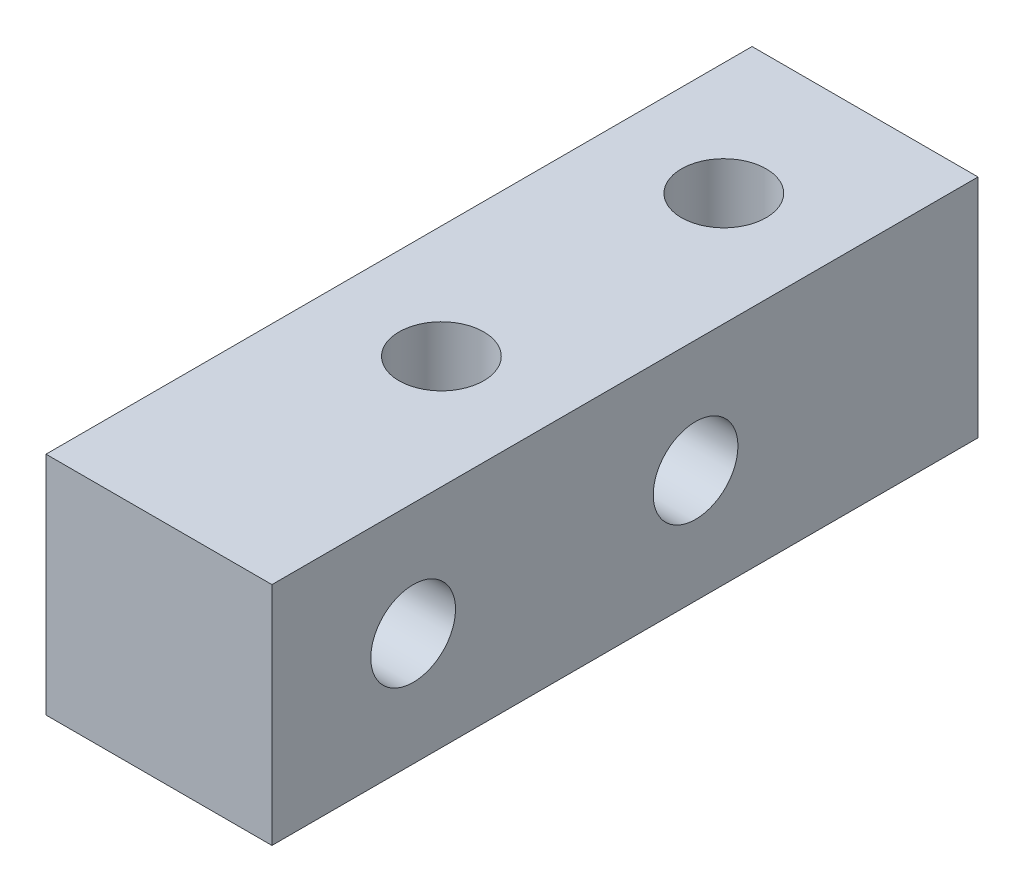
ISO-10303-21;
HEADER;
FILE_DESCRIPTION(('STEP AP214'),'2;1');
FILE_NAME('part.step','',(''),(''),'','','');
FILE_SCHEMA(('AUTOMOTIVE_DESIGN { 1 0 10303 214 1 1 1 1 }'));
ENDSEC;
DATA;
#1=APPLICATION_CONTEXT('core data for automotive mechanical design processes');
#2=APPLICATION_PROTOCOL_DEFINITION('international standard','automotive_design',2000,#1);
#3=PRODUCT_CONTEXT('',#1,'mechanical');
#4=PRODUCT('Part','Part','',(#3));
#5=PRODUCT_RELATED_PRODUCT_CATEGORY('part','',(#4));
#6=PRODUCT_DEFINITION_FORMATION('','',#4);
#7=PRODUCT_DEFINITION_CONTEXT('part definition',#1,'design');
#8=PRODUCT_DEFINITION('design','',#6,#7);
#9=PRODUCT_DEFINITION_SHAPE('','',#8);
#10=(LENGTH_UNIT() NAMED_UNIT(*) SI_UNIT(.MILLI.,.METRE.));
#11=(NAMED_UNIT(*) PLANE_ANGLE_UNIT() SI_UNIT($,.RADIAN.));
#12=(NAMED_UNIT(*) SI_UNIT($,.STERADIAN.) SOLID_ANGLE_UNIT());
#13=UNCERTAINTY_MEASURE_WITH_UNIT(LENGTH_MEASURE(1.E-05),#10,'distance_accuracy_value','');
#14=(GEOMETRIC_REPRESENTATION_CONTEXT(3) GLOBAL_UNCERTAINTY_ASSIGNED_CONTEXT((#13)) GLOBAL_UNIT_ASSIGNED_CONTEXT((#10,
#11,#12)) REPRESENTATION_CONTEXT('',''));
#15=CARTESIAN_POINT('',(0.,0.,0.));
#16=DIRECTION('',(0.,0.,1.));
#17=DIRECTION('',(1.,0.,0.));
#18=AXIS2_PLACEMENT_3D('',#15,#16,#17);
#19=CARTESIAN_POINT('',(0.,0.,25.));
#20=DIRECTION('',(1.,0.,0.));
#21=DIRECTION('',(0.,1.,0.));
#22=AXIS2_PLACEMENT_3D('',#19,#20,#21);
#23=PLANE('',#22);
#24=CARTESIAN_POINT('',(0.,4.,20.));
#25=DIRECTION('',(1.,0.,0.));
#26=DIRECTION('',(0.,1.,0.));
#27=AXIS2_PLACEMENT_3D('',#24,#25,#26);
#28=CIRCLE('',#27,1.5);
#29=CARTESIAN_POINT('',(0.,4.,18.5));
#30=VERTEX_POINT('',#29);
#31=EDGE_CURVE('E127',#30,#30,#28,.T.);
#32=ORIENTED_EDGE('',*,*,#31,.T.);
#33=EDGE_LOOP('',(#32));
#34=FACE_BOUND('',#33,.T.);
#35=CARTESIAN_POINT('',(0.,4.,10.));
#36=DIRECTION('',(1.,0.,0.));
#37=DIRECTION('',(0.,1.,0.));
#38=AXIS2_PLACEMENT_3D('',#35,#36,#37);
#39=CIRCLE('',#38,1.5);
#40=CARTESIAN_POINT('',(0.,4.,8.5));
#41=VERTEX_POINT('',#40);
#42=EDGE_CURVE('E132',#41,#41,#39,.T.);
#43=ORIENTED_EDGE('',*,*,#42,.T.);
#44=EDGE_LOOP('',(#43));
#45=FACE_BOUND('',#44,.T.);
#46=DIRECTION('',(0.,-1.,0.));
#47=VECTOR('',#46,1.);
#48=CARTESIAN_POINT('',(0.,0.,0.));
#49=LINE('',#48,#47);
#50=CARTESIAN_POINT('',(0.,8.,0.));
#51=VERTEX_POINT('',#50);
#52=CARTESIAN_POINT('',(0.,0.,0.));
#53=VERTEX_POINT('',#52);
#54=EDGE_CURVE('E104',#51,#53,#49,.T.);
#55=ORIENTED_EDGE('',*,*,#54,.T.);
#56=DIRECTION('',(0.,0.,-1.));
#57=VECTOR('',#56,1.);
#58=CARTESIAN_POINT('',(0.,0.,25.));
#59=LINE('',#58,#57);
#60=CARTESIAN_POINT('',(0.,0.,25.));
#61=VERTEX_POINT('',#60);
#62=EDGE_CURVE('E11',#61,#53,#59,.T.);
#63=ORIENTED_EDGE('',*,*,#62,.F.);
#64=DIRECTION('',(0.,-1.,0.));
#65=VECTOR('',#64,1.);
#66=CARTESIAN_POINT('',(0.,0.,25.));
#67=LINE('',#66,#65);
#68=CARTESIAN_POINT('',(0.,8.,25.));
#69=VERTEX_POINT('',#68);
#70=EDGE_CURVE('E92',#69,#61,#67,.T.);
#71=ORIENTED_EDGE('',*,*,#70,.F.);
#72=DIRECTION('',(0.,0.,-1.));
#73=VECTOR('',#72,1.);
#74=CARTESIAN_POINT('',(0.,8.,25.));
#75=LINE('',#74,#73);
#76=EDGE_CURVE('E100',#69,#51,#75,.T.);
#77=ORIENTED_EDGE('',*,*,#76,.T.);
#78=EDGE_LOOP('',(#55,#63,#71,#77));
#79=FACE_BOUND('',#78,.T.);
#80=ADVANCED_FACE('F41',(#34,#45,#79),#23,.F.);
#81=CARTESIAN_POINT('',(0.,0.,25.));
#82=DIRECTION('',(0.,1.,0.));
#83=DIRECTION('',(0.,0.,1.));
#84=AXIS2_PLACEMENT_3D('',#81,#82,#83);
#85=PLANE('',#84);
#86=CARTESIAN_POINT('',(4.,0.,5.));
#87=DIRECTION('',(0.,1.,0.));
#88=DIRECTION('',(0.,0.,1.));
#89=AXIS2_PLACEMENT_3D('',#86,#87,#88);
#90=CIRCLE('',#89,1.5);
#91=CARTESIAN_POINT('',(4.,0.,6.5));
#92=VERTEX_POINT('',#91);
#93=EDGE_CURVE('E107',#92,#92,#90,.T.);
#94=ORIENTED_EDGE('',*,*,#93,.T.);
#95=EDGE_LOOP('',(#94));
#96=FACE_BOUND('',#95,.T.);
#97=CARTESIAN_POINT('',(4.,0.,15.));
#98=DIRECTION('',(0.,1.,0.));
#99=DIRECTION('',(0.,0.,1.));
#100=AXIS2_PLACEMENT_3D('',#97,#98,#99);
#101=CIRCLE('',#100,1.5);
#102=CARTESIAN_POINT('',(4.,0.,16.5));
#103=VERTEX_POINT('',#102);
#104=EDGE_CURVE('E120',#103,#103,#101,.T.);
#105=ORIENTED_EDGE('',*,*,#104,.T.);
#106=EDGE_LOOP('',(#105));
#107=FACE_BOUND('',#106,.T.);
#108=DIRECTION('',(1.,0.,0.));
#109=VECTOR('',#108,1.);
#110=CARTESIAN_POINT('',(0.,0.,0.));
#111=LINE('',#110,#109);
#112=CARTESIAN_POINT('',(8.,0.,0.));
#113=VERTEX_POINT('',#112);
#114=EDGE_CURVE('E96',#53,#113,#111,.T.);
#115=ORIENTED_EDGE('',*,*,#114,.T.);
#116=DIRECTION('',(0.,0.,-1.));
#117=VECTOR('',#116,1.);
#118=CARTESIAN_POINT('',(8.,0.,25.));
#119=LINE('',#118,#117);
#120=CARTESIAN_POINT('',(8.,0.,25.));
#121=VERTEX_POINT('',#120);
#122=EDGE_CURVE('E49',#121,#113,#119,.T.);
#123=ORIENTED_EDGE('',*,*,#122,.F.);
#124=DIRECTION('',(1.,0.,0.));
#125=VECTOR('',#124,1.);
#126=CARTESIAN_POINT('',(0.,0.,25.));
#127=LINE('',#126,#125);
#128=EDGE_CURVE('E87',#61,#121,#127,.T.);
#129=ORIENTED_EDGE('',*,*,#128,.F.);
#130=ORIENTED_EDGE('',*,*,#62,.T.);
#131=EDGE_LOOP('',(#115,#123,#129,#130));
#132=FACE_BOUND('',#131,.T.);
#133=ADVANCED_FACE('F95',(#96,#107,#132),#85,.F.);
#134=CARTESIAN_POINT('',(8.,0.,25.));
#135=DIRECTION('',(-1.,0.,0.));
#136=DIRECTION('',(0.,0.,1.));
#137=AXIS2_PLACEMENT_3D('',#134,#135,#136);
#138=PLANE('',#137);
#139=CARTESIAN_POINT('',(8.,4.,20.));
#140=DIRECTION('',(1.,0.,0.));
#141=DIRECTION('',(0.,0.,-1.));
#142=AXIS2_PLACEMENT_3D('',#139,#140,#141);
#143=CIRCLE('',#142,1.5);
#144=CARTESIAN_POINT('',(8.,4.,18.5));
#145=VERTEX_POINT('',#144);
#146=EDGE_CURVE('E135',#145,#145,#143,.T.);
#147=ORIENTED_EDGE('',*,*,#146,.F.);
#148=EDGE_LOOP('',(#147));
#149=FACE_BOUND('',#148,.T.);
#150=CARTESIAN_POINT('',(8.,4.,10.));
#151=DIRECTION('',(1.,0.,0.));
#152=DIRECTION('',(0.,0.,-1.));
#153=AXIS2_PLACEMENT_3D('',#150,#151,#152);
#154=CIRCLE('',#153,1.5);
#155=CARTESIAN_POINT('',(8.,4.,8.5));
#156=VERTEX_POINT('',#155);
#157=EDGE_CURVE('E136',#156,#156,#154,.T.);
#158=ORIENTED_EDGE('',*,*,#157,.F.);
#159=EDGE_LOOP('',(#158));
#160=FACE_BOUND('',#159,.T.);
#161=DIRECTION('',(0.,1.,0.));
#162=VECTOR('',#161,1.);
#163=CARTESIAN_POINT('',(8.,0.,0.));
#164=LINE('',#163,#162);
#165=CARTESIAN_POINT('',(8.,8.,0.));
#166=VERTEX_POINT('',#165);
#167=EDGE_CURVE('E74',#113,#166,#164,.T.);
#168=ORIENTED_EDGE('',*,*,#167,.T.);
#169=DIRECTION('',(0.,0.,-1.));
#170=VECTOR('',#169,1.);
#171=CARTESIAN_POINT('',(8.,8.,25.));
#172=LINE('',#171,#170);
#173=CARTESIAN_POINT('',(8.,8.,25.));
#174=VERTEX_POINT('',#173);
#175=EDGE_CURVE('E97',#174,#166,#172,.T.);
#176=ORIENTED_EDGE('',*,*,#175,.F.);
#177=DIRECTION('',(0.,1.,0.));
#178=VECTOR('',#177,1.);
#179=CARTESIAN_POINT('',(8.,0.,25.));
#180=LINE('',#179,#178);
#181=EDGE_CURVE('E90',#121,#174,#180,.T.);
#182=ORIENTED_EDGE('',*,*,#181,.F.);
#183=ORIENTED_EDGE('',*,*,#122,.T.);
#184=EDGE_LOOP('',(#168,#176,#182,#183));
#185=FACE_BOUND('',#184,.T.);
#186=ADVANCED_FACE('F98',(#149,#160,#185),#138,.F.);
#187=CARTESIAN_POINT('',(0.,8.,25.));
#188=DIRECTION('',(0.,-1.,0.));
#189=DIRECTION('',(0.,0.,-1.));
#190=AXIS2_PLACEMENT_3D('',#187,#188,#189);
#191=PLANE('',#190);
#192=CARTESIAN_POINT('',(4.,8.,5.));
#193=DIRECTION('',(0.,1.,0.));
#194=DIRECTION('',(0.,0.,1.));
#195=AXIS2_PLACEMENT_3D('',#192,#193,#194);
#196=CIRCLE('',#195,1.5);
#197=CARTESIAN_POINT('',(4.,8.,6.5));
#198=VERTEX_POINT('',#197);
#199=EDGE_CURVE('E123',#198,#198,#196,.T.);
#200=ORIENTED_EDGE('',*,*,#199,.F.);
#201=EDGE_LOOP('',(#200));
#202=FACE_BOUND('',#201,.T.);
#203=CARTESIAN_POINT('',(4.,8.,15.));
#204=DIRECTION('',(0.,1.,0.));
#205=DIRECTION('',(0.,0.,1.));
#206=AXIS2_PLACEMENT_3D('',#203,#204,#205);
#207=CIRCLE('',#206,1.5);
#208=CARTESIAN_POINT('',(4.,8.,16.5));
#209=VERTEX_POINT('',#208);
#210=EDGE_CURVE('E124',#209,#209,#207,.T.);
#211=ORIENTED_EDGE('',*,*,#210,.F.);
#212=EDGE_LOOP('',(#211));
#213=FACE_BOUND('',#212,.T.);
#214=DIRECTION('',(-1.,0.,0.));
#215=VECTOR('',#214,1.);
#216=CARTESIAN_POINT('',(0.,8.,0.));
#217=LINE('',#216,#215);
#218=EDGE_CURVE('E80',#166,#51,#217,.T.);
#219=ORIENTED_EDGE('',*,*,#218,.T.);
#220=ORIENTED_EDGE('',*,*,#76,.F.);
#221=DIRECTION('',(-1.,0.,0.));
#222=VECTOR('',#221,1.);
#223=CARTESIAN_POINT('',(0.,8.,25.));
#224=LINE('',#223,#222);
#225=EDGE_CURVE('E57',#174,#69,#224,.T.);
#226=ORIENTED_EDGE('',*,*,#225,.F.);
#227=ORIENTED_EDGE('',*,*,#175,.T.);
#228=EDGE_LOOP('',(#219,#220,#226,#227));
#229=FACE_BOUND('',#228,.T.);
#230=ADVANCED_FACE('F112',(#202,#213,#229),#191,.F.);
#231=CARTESIAN_POINT('',(0.,0.,25.));
#232=DIRECTION('',(0.,0.,-1.));
#233=DIRECTION('',(-1.,0.,0.));
#234=AXIS2_PLACEMENT_3D('',#231,#232,#233);
#235=PLANE('',#234);
#236=ORIENTED_EDGE('',*,*,#70,.T.);
#237=ORIENTED_EDGE('',*,*,#128,.T.);
#238=ORIENTED_EDGE('',*,*,#181,.T.);
#239=ORIENTED_EDGE('',*,*,#225,.T.);
#240=EDGE_LOOP('',(#236,#237,#238,#239));
#241=FACE_BOUND('',#240,.T.);
#242=ADVANCED_FACE('F88',(#241),#235,.F.);
#243=CARTESIAN_POINT('',(0.,0.,0.));
#244=DIRECTION('',(0.,0.,-1.));
#245=DIRECTION('',(-1.,0.,0.));
#246=AXIS2_PLACEMENT_3D('',#243,#244,#245);
#247=PLANE('',#246);
#248=ORIENTED_EDGE('',*,*,#54,.F.);
#249=ORIENTED_EDGE('',*,*,#218,.F.);
#250=ORIENTED_EDGE('',*,*,#167,.F.);
#251=ORIENTED_EDGE('',*,*,#114,.F.);
#252=EDGE_LOOP('',(#248,#249,#250,#251));
#253=FACE_BOUND('',#252,.T.);
#254=ADVANCED_FACE('F115',(#253),#247,.T.);
#255=CARTESIAN_POINT('',(4.,-13.,15.));
#256=DIRECTION('',(0.,1.,0.));
#257=DIRECTION('',(0.,0.,1.));
#258=AXIS2_PLACEMENT_3D('',#255,#256,#257);
#259=CYLINDRICAL_SURFACE('',#258,1.5);
#260=CARTESIAN_POINT('',(4.,8.,16.5));
#261=CARTESIAN_POINT('',(4.,7.91666666666667,16.5));
#262=CARTESIAN_POINT('',(4.,7.83333333333333,16.5));
#263=CARTESIAN_POINT('',(4.,7.66666666666667,16.5));
#264=CARTESIAN_POINT('',(4.,7.58333333333333,16.5));
#265=CARTESIAN_POINT('',(4.,7.41666666666667,16.5));
#266=CARTESIAN_POINT('',(4.,7.33333333333333,16.5));
#267=CARTESIAN_POINT('',(4.,7.16666666666667,16.5));
#268=CARTESIAN_POINT('',(4.,7.08333333333333,16.5));
#269=CARTESIAN_POINT('',(4.,6.91666666666667,16.5));
#270=CARTESIAN_POINT('',(4.,6.83333333333333,16.5));
#271=CARTESIAN_POINT('',(4.,6.66666666666667,16.5));
#272=CARTESIAN_POINT('',(4.,6.58333333333333,16.5));
#273=CARTESIAN_POINT('',(4.,6.41666666666667,16.5));
#274=CARTESIAN_POINT('',(4.,6.33333333333333,16.5));
#275=CARTESIAN_POINT('',(4.,6.16666666666667,16.5));
#276=CARTESIAN_POINT('',(4.,6.08333333333333,16.5));
#277=CARTESIAN_POINT('',(4.,5.91666666666666,16.5));
#278=CARTESIAN_POINT('',(4.,5.83333333333333,16.5));
#279=CARTESIAN_POINT('',(4.,5.66666666666666,16.5));
#280=CARTESIAN_POINT('',(4.,5.58333333333333,16.5));
#281=CARTESIAN_POINT('',(4.,5.41666666666666,16.5));
#282=CARTESIAN_POINT('',(4.,5.33333333333333,16.5));
#283=CARTESIAN_POINT('',(4.,5.16666666666666,16.5));
#284=CARTESIAN_POINT('',(4.,5.08333333333333,16.5));
#285=CARTESIAN_POINT('',(4.,4.91666666666666,16.5));
#286=CARTESIAN_POINT('',(4.,4.83333333333333,16.5));
#287=CARTESIAN_POINT('',(4.,4.66666666666666,16.5));
#288=CARTESIAN_POINT('',(4.,4.58333333333333,16.5));
#289=CARTESIAN_POINT('',(4.,4.41666666666666,16.5));
#290=CARTESIAN_POINT('',(4.,4.33333333333333,16.5));
#291=CARTESIAN_POINT('',(4.,4.16666666666666,16.5));
#292=CARTESIAN_POINT('',(4.,4.08333333333333,16.5));
#293=CARTESIAN_POINT('',(4.,3.91666666666666,16.5));
#294=CARTESIAN_POINT('',(4.,3.83333333333333,16.5));
#295=CARTESIAN_POINT('',(4.,3.66666666666666,16.5));
#296=CARTESIAN_POINT('',(4.,3.58333333333333,16.5));
#297=CARTESIAN_POINT('',(4.,3.41666666666666,16.5));
#298=CARTESIAN_POINT('',(4.,3.33333333333333,16.5));
#299=CARTESIAN_POINT('',(4.,3.16666666666666,16.5));
#300=CARTESIAN_POINT('',(4.,3.08333333333333,16.5));
#301=CARTESIAN_POINT('',(4.,2.91666666666666,16.5));
#302=CARTESIAN_POINT('',(4.,2.83333333333333,16.5));
#303=CARTESIAN_POINT('',(4.,2.66666666666667,16.5));
#304=CARTESIAN_POINT('',(4.,2.58333333333333,16.5));
#305=CARTESIAN_POINT('',(4.,2.41666666666667,16.5));
#306=CARTESIAN_POINT('',(4.,2.33333333333333,16.5));
#307=CARTESIAN_POINT('',(4.,2.16666666666667,16.5));
#308=CARTESIAN_POINT('',(4.,2.08333333333333,16.5));
#309=CARTESIAN_POINT('',(4.,1.91666666666667,16.5));
#310=CARTESIAN_POINT('',(4.,1.83333333333333,16.5));
#311=CARTESIAN_POINT('',(4.,1.66666666666667,16.5));
#312=CARTESIAN_POINT('',(4.,1.58333333333333,16.5));
#313=CARTESIAN_POINT('',(4.,1.41666666666667,16.5));
#314=CARTESIAN_POINT('',(4.,1.33333333333333,16.5));
#315=CARTESIAN_POINT('',(4.,1.16666666666667,16.5));
#316=CARTESIAN_POINT('',(4.,1.08333333333333,16.5));
#317=CARTESIAN_POINT('',(4.,0.916666666666666,16.5));
#318=CARTESIAN_POINT('',(4.,0.833333333333332,16.5));
#319=CARTESIAN_POINT('',(4.,0.666666666666666,16.5));
#320=CARTESIAN_POINT('',(4.,0.583333333333332,16.5));
#321=CARTESIAN_POINT('',(4.,0.416666666666665,16.5));
#322=CARTESIAN_POINT('',(4.,0.333333333333332,16.5));
#323=CARTESIAN_POINT('',(4.,0.166666666666665,16.5));
#324=CARTESIAN_POINT('',(4.,0.0833333333333316,16.5));
#325=CARTESIAN_POINT('',(4.,0.,16.5));
#326=B_SPLINE_CURVE_WITH_KNOTS('',3,(#260,#261,#262,#263,#264,#265,#266,#267,#268,#269,#270,
#271,#272,#273,#274,#275,#276,#277,#278,#279,#280,#281,#282,#283,#284,#285,#286,#287,#288,#289,
#290,#291,#292,#293,#294,#295,#296,#297,#298,#299,#300,#301,#302,#303,#304,#305,#306,#307,#308,
#309,#310,#311,#312,#313,#314,#315,#316,#317,#318,#319,#320,#321,#322,#323,#324,#325),
.UNSPECIFIED.,.F.,.F.,(4,2,2,2,2,2,2,2,2,2,2,2,2,2,2,2,2,2,2,2,2,2,2,2,2,2,2,2,2,2,2,2,4),(0.,
0.25,0.5,0.750000000000001,1.,1.25,1.5,1.75,2.,2.25,2.5,2.75,3.,3.25,3.5,3.75,4.,4.25,4.5,4.75,
5.,5.25,5.5,5.75,6.,6.25,6.5,6.75,7.,7.25,7.5,7.75,8.),.UNSPECIFIED.);
#327=EDGE_CURVE('BSEAM171',#209,#103,#326,.T.);
#328=ORIENTED_EDGE('',*,*,#210,.T.);
#329=ORIENTED_EDGE('',*,*,#104,.F.);
#330=ORIENTED_EDGE('',*,*,#327,.T.);
#331=ORIENTED_EDGE('',*,*,#327,.F.);
#332=EDGE_LOOP('',(#328,#330,#329,#331));
#333=FACE_BOUND('',#332,.T.);
#334=ADVANCED_FACE('F171',(#333),#259,.F.);
#335=CARTESIAN_POINT('',(4.,-13.,5.));
#336=DIRECTION('',(0.,1.,0.));
#337=DIRECTION('',(0.,0.,1.));
#338=AXIS2_PLACEMENT_3D('',#335,#336,#337);
#339=CYLINDRICAL_SURFACE('',#338,1.5);
#340=CARTESIAN_POINT('',(4.,8.,6.5));
#341=CARTESIAN_POINT('',(4.,7.91666666666667,6.5));
#342=CARTESIAN_POINT('',(4.,7.83333333333333,6.5));
#343=CARTESIAN_POINT('',(4.,7.66666666666667,6.5));
#344=CARTESIAN_POINT('',(4.,7.58333333333333,6.5));
#345=CARTESIAN_POINT('',(4.,7.41666666666667,6.5));
#346=CARTESIAN_POINT('',(4.,7.33333333333333,6.5));
#347=CARTESIAN_POINT('',(4.,7.16666666666667,6.5));
#348=CARTESIAN_POINT('',(4.,7.08333333333333,6.5));
#349=CARTESIAN_POINT('',(4.,6.91666666666667,6.5));
#350=CARTESIAN_POINT('',(4.,6.83333333333333,6.5));
#351=CARTESIAN_POINT('',(4.,6.66666666666667,6.5));
#352=CARTESIAN_POINT('',(4.,6.58333333333333,6.5));
#353=CARTESIAN_POINT('',(4.,6.41666666666667,6.5));
#354=CARTESIAN_POINT('',(4.,6.33333333333333,6.5));
#355=CARTESIAN_POINT('',(4.,6.16666666666667,6.5));
#356=CARTESIAN_POINT('',(4.,6.08333333333333,6.5));
#357=CARTESIAN_POINT('',(4.,5.91666666666666,6.5));
#358=CARTESIAN_POINT('',(4.,5.83333333333333,6.5));
#359=CARTESIAN_POINT('',(4.,5.66666666666666,6.5));
#360=CARTESIAN_POINT('',(4.,5.58333333333333,6.5));
#361=CARTESIAN_POINT('',(4.,5.41666666666666,6.5));
#362=CARTESIAN_POINT('',(4.,5.33333333333333,6.5));
#363=CARTESIAN_POINT('',(4.,5.16666666666666,6.5));
#364=CARTESIAN_POINT('',(4.,5.08333333333333,6.5));
#365=CARTESIAN_POINT('',(4.,4.91666666666666,6.5));
#366=CARTESIAN_POINT('',(4.,4.83333333333333,6.5));
#367=CARTESIAN_POINT('',(4.,4.66666666666666,6.5));
#368=CARTESIAN_POINT('',(4.,4.58333333333333,6.5));
#369=CARTESIAN_POINT('',(4.,4.41666666666666,6.5));
#370=CARTESIAN_POINT('',(4.,4.33333333333333,6.5));
#371=CARTESIAN_POINT('',(4.,4.16666666666666,6.5));
#372=CARTESIAN_POINT('',(4.,4.08333333333333,6.5));
#373=CARTESIAN_POINT('',(4.,3.91666666666666,6.5));
#374=CARTESIAN_POINT('',(4.,3.83333333333333,6.5));
#375=CARTESIAN_POINT('',(4.,3.66666666666666,6.5));
#376=CARTESIAN_POINT('',(4.,3.58333333333333,6.5));
#377=CARTESIAN_POINT('',(4.,3.41666666666666,6.5));
#378=CARTESIAN_POINT('',(4.,3.33333333333333,6.5));
#379=CARTESIAN_POINT('',(4.,3.16666666666666,6.5));
#380=CARTESIAN_POINT('',(4.,3.08333333333333,6.5));
#381=CARTESIAN_POINT('',(4.,2.91666666666666,6.5));
#382=CARTESIAN_POINT('',(4.,2.83333333333333,6.5));
#383=CARTESIAN_POINT('',(4.,2.66666666666667,6.5));
#384=CARTESIAN_POINT('',(4.,2.58333333333333,6.5));
#385=CARTESIAN_POINT('',(4.,2.41666666666667,6.5));
#386=CARTESIAN_POINT('',(4.,2.33333333333333,6.5));
#387=CARTESIAN_POINT('',(4.,2.16666666666667,6.5));
#388=CARTESIAN_POINT('',(4.,2.08333333333333,6.5));
#389=CARTESIAN_POINT('',(4.,1.91666666666667,6.5));
#390=CARTESIAN_POINT('',(4.,1.83333333333333,6.5));
#391=CARTESIAN_POINT('',(4.,1.66666666666667,6.5));
#392=CARTESIAN_POINT('',(4.,1.58333333333333,6.5));
#393=CARTESIAN_POINT('',(4.,1.41666666666667,6.5));
#394=CARTESIAN_POINT('',(4.,1.33333333333333,6.5));
#395=CARTESIAN_POINT('',(4.,1.16666666666667,6.5));
#396=CARTESIAN_POINT('',(4.,1.08333333333333,6.5));
#397=CARTESIAN_POINT('',(4.,0.916666666666666,6.5));
#398=CARTESIAN_POINT('',(4.,0.833333333333332,6.5));
#399=CARTESIAN_POINT('',(4.,0.666666666666666,6.5));
#400=CARTESIAN_POINT('',(4.,0.583333333333332,6.5));
#401=CARTESIAN_POINT('',(4.,0.416666666666665,6.5));
#402=CARTESIAN_POINT('',(4.,0.333333333333332,6.5));
#403=CARTESIAN_POINT('',(4.,0.166666666666665,6.5));
#404=CARTESIAN_POINT('',(4.,0.0833333333333316,6.5));
#405=CARTESIAN_POINT('',(4.,0.,6.5));
#406=B_SPLINE_CURVE_WITH_KNOTS('',3,(#340,#341,#342,#343,#344,#345,#346,#347,#348,#349,#350,
#351,#352,#353,#354,#355,#356,#357,#358,#359,#360,#361,#362,#363,#364,#365,#366,#367,#368,#369,
#370,#371,#372,#373,#374,#375,#376,#377,#378,#379,#380,#381,#382,#383,#384,#385,#386,#387,#388,
#389,#390,#391,#392,#393,#394,#395,#396,#397,#398,#399,#400,#401,#402,#403,#404,#405),
.UNSPECIFIED.,.F.,.F.,(4,2,2,2,2,2,2,2,2,2,2,2,2,2,2,2,2,2,2,2,2,2,2,2,2,2,2,2,2,2,2,2,4),(0.,
0.25,0.5,0.750000000000001,1.,1.25,1.5,1.75,2.,2.25,2.5,2.75,3.,3.25,3.5,3.75,4.,4.25,4.5,4.75,
5.,5.25,5.5,5.75,6.,6.25,6.5,6.75,7.,7.25,7.5,7.75,8.),.UNSPECIFIED.);
#407=EDGE_CURVE('BSEAM153',#198,#92,#406,.T.);
#408=ORIENTED_EDGE('',*,*,#199,.T.);
#409=ORIENTED_EDGE('',*,*,#93,.F.);
#410=ORIENTED_EDGE('',*,*,#407,.T.);
#411=ORIENTED_EDGE('',*,*,#407,.F.);
#412=EDGE_LOOP('',(#408,#410,#409,#411));
#413=FACE_BOUND('',#412,.T.);
#414=ADVANCED_FACE('F153',(#413),#339,.F.);
#415=CARTESIAN_POINT('',(-13.,4.,10.));
#416=DIRECTION('',(1.,0.,0.));
#417=DIRECTION('',(0.,0.,-1.));
#418=AXIS2_PLACEMENT_3D('',#415,#416,#417);
#419=CYLINDRICAL_SURFACE('',#418,1.5);
#420=CARTESIAN_POINT('',(8.,4.,8.5));
#421=CARTESIAN_POINT('',(7.91666666666667,4.,8.5));
#422=CARTESIAN_POINT('',(7.83333333333333,4.,8.5));
#423=CARTESIAN_POINT('',(7.66666666666667,4.,8.5));
#424=CARTESIAN_POINT('',(7.58333333333333,4.,8.5));
#425=CARTESIAN_POINT('',(7.41666666666667,4.,8.5));
#426=CARTESIAN_POINT('',(7.33333333333333,4.,8.5));
#427=CARTESIAN_POINT('',(7.16666666666667,4.,8.5));
#428=CARTESIAN_POINT('',(7.08333333333333,4.,8.5));
#429=CARTESIAN_POINT('',(6.91666666666667,4.,8.5));
#430=CARTESIAN_POINT('',(6.83333333333333,4.,8.5));
#431=CARTESIAN_POINT('',(6.66666666666667,4.,8.5));
#432=CARTESIAN_POINT('',(6.58333333333333,4.,8.5));
#433=CARTESIAN_POINT('',(6.41666666666667,4.,8.5));
#434=CARTESIAN_POINT('',(6.33333333333333,4.,8.5));
#435=CARTESIAN_POINT('',(6.16666666666667,4.,8.5));
#436=CARTESIAN_POINT('',(6.08333333333333,4.,8.5));
#437=CARTESIAN_POINT('',(5.91666666666666,4.,8.5));
#438=CARTESIAN_POINT('',(5.83333333333333,4.,8.5));
#439=CARTESIAN_POINT('',(5.66666666666666,4.,8.5));
#440=CARTESIAN_POINT('',(5.58333333333333,4.,8.5));
#441=CARTESIAN_POINT('',(5.41666666666666,4.,8.5));
#442=CARTESIAN_POINT('',(5.33333333333333,4.,8.5));
#443=CARTESIAN_POINT('',(5.16666666666666,4.,8.5));
#444=CARTESIAN_POINT('',(5.08333333333333,4.,8.5));
#445=CARTESIAN_POINT('',(4.91666666666666,4.,8.5));
#446=CARTESIAN_POINT('',(4.83333333333333,4.,8.5));
#447=CARTESIAN_POINT('',(4.66666666666666,4.,8.5));
#448=CARTESIAN_POINT('',(4.58333333333333,4.,8.5));
#449=CARTESIAN_POINT('',(4.41666666666666,4.,8.5));
#450=CARTESIAN_POINT('',(4.33333333333333,4.,8.5));
#451=CARTESIAN_POINT('',(4.16666666666666,4.,8.5));
#452=CARTESIAN_POINT('',(4.08333333333333,4.,8.5));
#453=CARTESIAN_POINT('',(3.91666666666666,4.,8.5));
#454=CARTESIAN_POINT('',(3.83333333333333,4.,8.5));
#455=CARTESIAN_POINT('',(3.66666666666666,4.,8.5));
#456=CARTESIAN_POINT('',(3.58333333333333,4.,8.5));
#457=CARTESIAN_POINT('',(3.41666666666666,4.,8.5));
#458=CARTESIAN_POINT('',(3.33333333333333,4.,8.5));
#459=CARTESIAN_POINT('',(3.16666666666666,4.,8.5));
#460=CARTESIAN_POINT('',(3.08333333333333,4.,8.5));
#461=CARTESIAN_POINT('',(2.91666666666666,4.,8.5));
#462=CARTESIAN_POINT('',(2.83333333333333,4.,8.5));
#463=CARTESIAN_POINT('',(2.66666666666667,4.,8.5));
#464=CARTESIAN_POINT('',(2.58333333333333,4.,8.5));
#465=CARTESIAN_POINT('',(2.41666666666667,4.,8.5));
#466=CARTESIAN_POINT('',(2.33333333333333,4.,8.5));
#467=CARTESIAN_POINT('',(2.16666666666667,4.,8.5));
#468=CARTESIAN_POINT('',(2.08333333333333,4.,8.5));
#469=CARTESIAN_POINT('',(1.91666666666667,4.,8.5));
#470=CARTESIAN_POINT('',(1.83333333333333,4.,8.5));
#471=CARTESIAN_POINT('',(1.66666666666667,4.,8.5));
#472=CARTESIAN_POINT('',(1.58333333333333,4.,8.5));
#473=CARTESIAN_POINT('',(1.41666666666667,4.,8.5));
#474=CARTESIAN_POINT('',(1.33333333333333,4.,8.5));
#475=CARTESIAN_POINT('',(1.16666666666667,4.,8.5));
#476=CARTESIAN_POINT('',(1.08333333333333,4.,8.5));
#477=CARTESIAN_POINT('',(0.916666666666666,4.,8.5));
#478=CARTESIAN_POINT('',(0.833333333333332,4.,8.5));
#479=CARTESIAN_POINT('',(0.666666666666666,4.,8.5));
#480=CARTESIAN_POINT('',(0.583333333333332,4.,8.5));
#481=CARTESIAN_POINT('',(0.416666666666665,4.,8.5));
#482=CARTESIAN_POINT('',(0.333333333333332,4.,8.5));
#483=CARTESIAN_POINT('',(0.166666666666665,4.,8.5));
#484=CARTESIAN_POINT('',(0.0833333333333316,4.,8.5));
#485=CARTESIAN_POINT('',(0.,4.,8.5));
#486=B_SPLINE_CURVE_WITH_KNOTS('',3,(#420,#421,#422,#423,#424,#425,#426,#427,#428,#429,#430,
#431,#432,#433,#434,#435,#436,#437,#438,#439,#440,#441,#442,#443,#444,#445,#446,#447,#448,#449,
#450,#451,#452,#453,#454,#455,#456,#457,#458,#459,#460,#461,#462,#463,#464,#465,#466,#467,#468,
#469,#470,#471,#472,#473,#474,#475,#476,#477,#478,#479,#480,#481,#482,#483,#484,#485),
.UNSPECIFIED.,.F.,.F.,(4,2,2,2,2,2,2,2,2,2,2,2,2,2,2,2,2,2,2,2,2,2,2,2,2,2,2,2,2,2,2,2,4),(0.,
0.25,0.5,0.750000000000001,1.,1.25,1.5,1.75,2.,2.25,2.5,2.75,3.,3.25,3.5,3.75,4.,4.25,4.5,4.75,
5.,5.25,5.5,5.75,6.,6.25,6.5,6.75,7.,7.25,7.5,7.75,8.),.UNSPECIFIED.);
#487=EDGE_CURVE('BSEAM150',#156,#41,#486,.T.);
#488=ORIENTED_EDGE('',*,*,#157,.T.);
#489=ORIENTED_EDGE('',*,*,#42,.F.);
#490=ORIENTED_EDGE('',*,*,#487,.T.);
#491=ORIENTED_EDGE('',*,*,#487,.F.);
#492=EDGE_LOOP('',(#488,#490,#489,#491));
#493=FACE_BOUND('',#492,.T.);
#494=ADVANCED_FACE('F150',(#493),#419,.F.);
#495=CARTESIAN_POINT('',(-13.,4.,20.));
#496=DIRECTION('',(1.,0.,0.));
#497=DIRECTION('',(0.,0.,-1.));
#498=AXIS2_PLACEMENT_3D('',#495,#496,#497);
#499=CYLINDRICAL_SURFACE('',#498,1.5);
#500=CARTESIAN_POINT('',(8.,4.,18.5));
#501=CARTESIAN_POINT('',(7.91666666666667,4.,18.5));
#502=CARTESIAN_POINT('',(7.83333333333333,4.,18.5));
#503=CARTESIAN_POINT('',(7.66666666666667,4.,18.5));
#504=CARTESIAN_POINT('',(7.58333333333333,4.,18.5));
#505=CARTESIAN_POINT('',(7.41666666666667,4.,18.5));
#506=CARTESIAN_POINT('',(7.33333333333333,4.,18.5));
#507=CARTESIAN_POINT('',(7.16666666666667,4.,18.5));
#508=CARTESIAN_POINT('',(7.08333333333333,4.,18.5));
#509=CARTESIAN_POINT('',(6.91666666666667,4.,18.5));
#510=CARTESIAN_POINT('',(6.83333333333333,4.,18.5));
#511=CARTESIAN_POINT('',(6.66666666666667,4.,18.5));
#512=CARTESIAN_POINT('',(6.58333333333333,4.,18.5));
#513=CARTESIAN_POINT('',(6.41666666666667,4.,18.5));
#514=CARTESIAN_POINT('',(6.33333333333333,4.,18.5));
#515=CARTESIAN_POINT('',(6.16666666666667,4.,18.5));
#516=CARTESIAN_POINT('',(6.08333333333333,4.,18.5));
#517=CARTESIAN_POINT('',(5.91666666666666,4.,18.5));
#518=CARTESIAN_POINT('',(5.83333333333333,4.,18.5));
#519=CARTESIAN_POINT('',(5.66666666666666,4.,18.5));
#520=CARTESIAN_POINT('',(5.58333333333333,4.,18.5));
#521=CARTESIAN_POINT('',(5.41666666666666,4.,18.5));
#522=CARTESIAN_POINT('',(5.33333333333333,4.,18.5));
#523=CARTESIAN_POINT('',(5.16666666666666,4.,18.5));
#524=CARTESIAN_POINT('',(5.08333333333333,4.,18.5));
#525=CARTESIAN_POINT('',(4.91666666666666,4.,18.5));
#526=CARTESIAN_POINT('',(4.83333333333333,4.,18.5));
#527=CARTESIAN_POINT('',(4.66666666666666,4.,18.5));
#528=CARTESIAN_POINT('',(4.58333333333333,4.,18.5));
#529=CARTESIAN_POINT('',(4.41666666666666,4.,18.5));
#530=CARTESIAN_POINT('',(4.33333333333333,4.,18.5));
#531=CARTESIAN_POINT('',(4.16666666666666,4.,18.5));
#532=CARTESIAN_POINT('',(4.08333333333333,4.,18.5));
#533=CARTESIAN_POINT('',(3.91666666666666,4.,18.5));
#534=CARTESIAN_POINT('',(3.83333333333333,4.,18.5));
#535=CARTESIAN_POINT('',(3.66666666666666,4.,18.5));
#536=CARTESIAN_POINT('',(3.58333333333333,4.,18.5));
#537=CARTESIAN_POINT('',(3.41666666666666,4.,18.5));
#538=CARTESIAN_POINT('',(3.33333333333333,4.,18.5));
#539=CARTESIAN_POINT('',(3.16666666666666,4.,18.5));
#540=CARTESIAN_POINT('',(3.08333333333333,4.,18.5));
#541=CARTESIAN_POINT('',(2.91666666666666,4.,18.5));
#542=CARTESIAN_POINT('',(2.83333333333333,4.,18.5));
#543=CARTESIAN_POINT('',(2.66666666666667,4.,18.5));
#544=CARTESIAN_POINT('',(2.58333333333333,4.,18.5));
#545=CARTESIAN_POINT('',(2.41666666666667,4.,18.5));
#546=CARTESIAN_POINT('',(2.33333333333333,4.,18.5));
#547=CARTESIAN_POINT('',(2.16666666666667,4.,18.5));
#548=CARTESIAN_POINT('',(2.08333333333333,4.,18.5));
#549=CARTESIAN_POINT('',(1.91666666666667,4.,18.5));
#550=CARTESIAN_POINT('',(1.83333333333333,4.,18.5));
#551=CARTESIAN_POINT('',(1.66666666666667,4.,18.5));
#552=CARTESIAN_POINT('',(1.58333333333333,4.,18.5));
#553=CARTESIAN_POINT('',(1.41666666666667,4.,18.5));
#554=CARTESIAN_POINT('',(1.33333333333333,4.,18.5));
#555=CARTESIAN_POINT('',(1.16666666666667,4.,18.5));
#556=CARTESIAN_POINT('',(1.08333333333333,4.,18.5));
#557=CARTESIAN_POINT('',(0.916666666666666,4.,18.5));
#558=CARTESIAN_POINT('',(0.833333333333332,4.,18.5));
#559=CARTESIAN_POINT('',(0.666666666666666,4.,18.5));
#560=CARTESIAN_POINT('',(0.583333333333332,4.,18.5));
#561=CARTESIAN_POINT('',(0.416666666666665,4.,18.5));
#562=CARTESIAN_POINT('',(0.333333333333332,4.,18.5));
#563=CARTESIAN_POINT('',(0.166666666666665,4.,18.5));
#564=CARTESIAN_POINT('',(0.0833333333333316,4.,18.5));
#565=CARTESIAN_POINT('',(0.,4.,18.5));
#566=B_SPLINE_CURVE_WITH_KNOTS('',3,(#500,#501,#502,#503,#504,#505,#506,#507,#508,#509,#510,
#511,#512,#513,#514,#515,#516,#517,#518,#519,#520,#521,#522,#523,#524,#525,#526,#527,#528,#529,
#530,#531,#532,#533,#534,#535,#536,#537,#538,#539,#540,#541,#542,#543,#544,#545,#546,#547,#548,
#549,#550,#551,#552,#553,#554,#555,#556,#557,#558,#559,#560,#561,#562,#563,#564,#565),
.UNSPECIFIED.,.F.,.F.,(4,2,2,2,2,2,2,2,2,2,2,2,2,2,2,2,2,2,2,2,2,2,2,2,2,2,2,2,2,2,2,2,4),(0.,
0.25,0.5,0.750000000000001,1.,1.25,1.5,1.75,2.,2.25,2.5,2.75,3.,3.25,3.5,3.75,4.,4.25,4.5,4.75,
5.,5.25,5.5,5.75,6.,6.25,6.5,6.75,7.,7.25,7.5,7.75,8.),.UNSPECIFIED.);
#567=EDGE_CURVE('BSEAM142',#145,#30,#566,.T.);
#568=ORIENTED_EDGE('',*,*,#146,.T.);
#569=ORIENTED_EDGE('',*,*,#31,.F.);
#570=ORIENTED_EDGE('',*,*,#567,.T.);
#571=ORIENTED_EDGE('',*,*,#567,.F.);
#572=EDGE_LOOP('',(#568,#570,#569,#571));
#573=FACE_BOUND('',#572,.T.);
#574=ADVANCED_FACE('F142',(#573),#499,.F.);
#575=CLOSED_SHELL('',(#80,#133,#186,#230,#242,#254,#334,#414,#494,#574));
#576=MANIFOLD_SOLID_BREP('B2',#575);
#577=ADVANCED_BREP_SHAPE_REPRESENTATION('',(#18,#576),#14);
#578=SHAPE_DEFINITION_REPRESENTATION(#9,#577);
ENDSEC;
END-ISO-10303-21;
